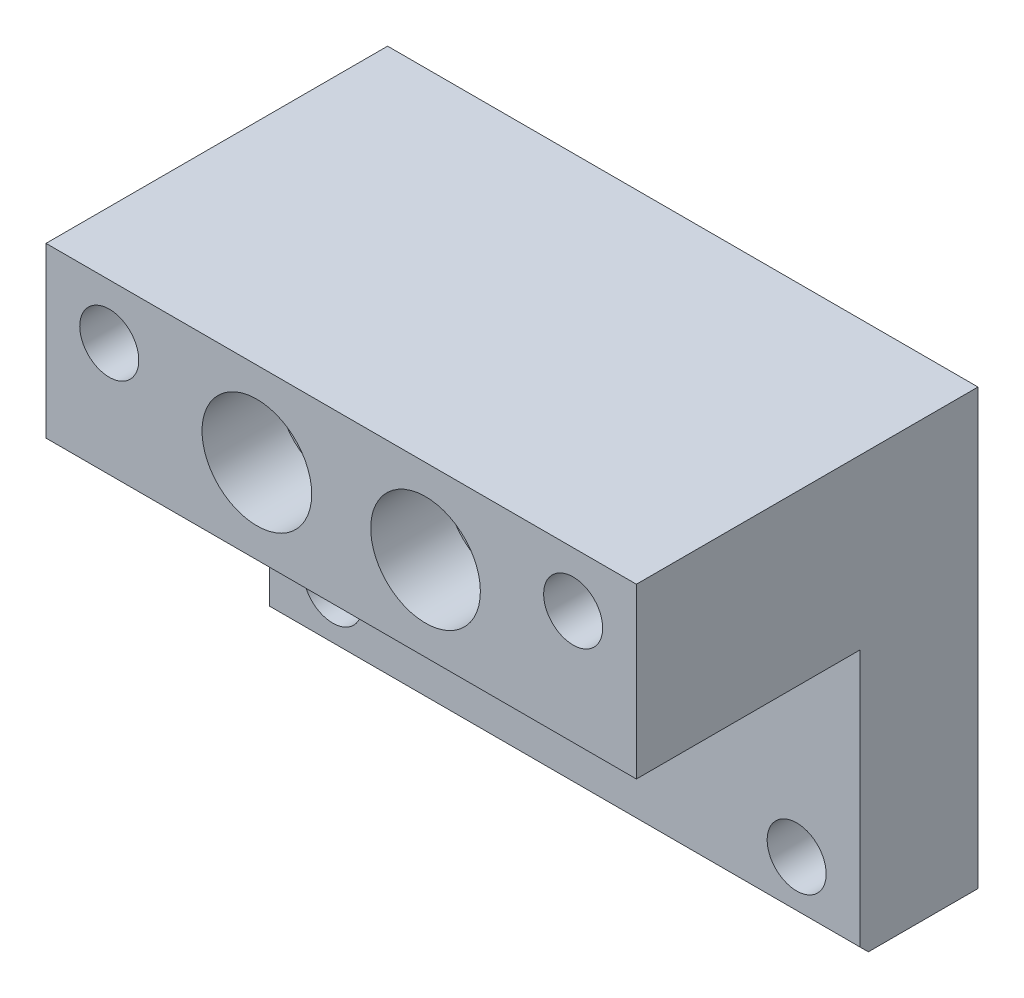
ISO-10303-21;
HEADER;
FILE_DESCRIPTION(('STEP AP214'),'2;1');
FILE_NAME('part.step','',(''),(''),'','','');
FILE_SCHEMA(('AUTOMOTIVE_DESIGN { 1 0 10303 214 1 1 1 1 }'));
ENDSEC;
DATA;
#1=APPLICATION_CONTEXT('core data for automotive mechanical design processes');
#2=APPLICATION_PROTOCOL_DEFINITION('international standard','automotive_design',2000,#1);
#3=PRODUCT_CONTEXT('',#1,'mechanical');
#4=PRODUCT('Part','Part','',(#3));
#5=PRODUCT_RELATED_PRODUCT_CATEGORY('part','',(#4));
#6=PRODUCT_DEFINITION_FORMATION('','',#4);
#7=PRODUCT_DEFINITION_CONTEXT('part definition',#1,'design');
#8=PRODUCT_DEFINITION('design','',#6,#7);
#9=PRODUCT_DEFINITION_SHAPE('','',#8);
#10=(LENGTH_UNIT() NAMED_UNIT(*) SI_UNIT(.MILLI.,.METRE.));
#11=(NAMED_UNIT(*) PLANE_ANGLE_UNIT() SI_UNIT($,.RADIAN.));
#12=(NAMED_UNIT(*) SI_UNIT($,.STERADIAN.) SOLID_ANGLE_UNIT());
#13=UNCERTAINTY_MEASURE_WITH_UNIT(LENGTH_MEASURE(1.E-05),#10,'distance_accuracy_value','');
#14=(GEOMETRIC_REPRESENTATION_CONTEXT(3) GLOBAL_UNCERTAINTY_ASSIGNED_CONTEXT((#13)) GLOBAL_UNIT_ASSIGNED_CONTEXT((#10,
#11,#12)) REPRESENTATION_CONTEXT('',''));
#15=CARTESIAN_POINT('',(0.,0.,0.));
#16=DIRECTION('',(0.,0.,1.));
#17=DIRECTION('',(1.,0.,0.));
#18=AXIS2_PLACEMENT_3D('',#15,#16,#17);
#19=CARTESIAN_POINT('',(0.,-18.5,40.5));
#20=DIRECTION('',(0.,0.,1.));
#21=DIRECTION('',(1.,0.,0.));
#22=AXIS2_PLACEMENT_3D('',#19,#20,#21);
#23=CYLINDRICAL_SURFACE('',#22,9.00000000000001);
#24=CARTESIAN_POINT('',(0.,-18.5,-40.5));
#25=DIRECTION('',(0.,0.,1.));
#26=DIRECTION('',(1.,0.,0.));
#27=AXIS2_PLACEMENT_3D('',#24,#25,#26);
#28=CIRCLE('',#27,9.00000000000001);
#29=CARTESIAN_POINT('',(9.00000000000002,-18.5,-40.5));
#30=VERTEX_POINT('',#29);
#31=EDGE_CURVE('E119',#30,#30,#28,.T.);
#32=ORIENTED_EDGE('',*,*,#31,.F.);
#33=EDGE_LOOP('',(#32));
#34=FACE_BOUND('',#33,.T.);
#35=CARTESIAN_POINT('',(0.,-18.5,-30.5));
#36=DIRECTION('',(0.,0.,1.));
#37=DIRECTION('',(1.,0.,0.));
#38=AXIS2_PLACEMENT_3D('',#35,#36,#37);
#39=CIRCLE('',#38,9.00000000000001);
#40=CARTESIAN_POINT('',(9.00000000000002,-18.5,-30.5));
#41=VERTEX_POINT('',#40);
#42=EDGE_CURVE('E161',#41,#41,#39,.F.);
#43=ORIENTED_EDGE('',*,*,#42,.F.);
#44=EDGE_LOOP('',(#43));
#45=FACE_BOUND('',#44,.T.);
#46=ADVANCED_FACE('F36',(#34,#45),#23,.F.);
#47=CARTESIAN_POINT('',(-70.,51.5,40.5));
#48=DIRECTION('',(1.,0.,0.));
#49=DIRECTION('',(0.,0.,-1.));
#50=AXIS2_PLACEMENT_3D('',#47,#48,#49);
#51=PLANE('',#50);
#52=DIRECTION('',(0.,0.,-1.));
#53=VECTOR('',#52,1.);
#54=CARTESIAN_POINT('',(-70.,-51.5,40.5));
#55=LINE('',#54,#53);
#56=CARTESIAN_POINT('',(-70.,-51.5,-14.5));
#57=VERTEX_POINT('',#56);
#58=CARTESIAN_POINT('',(-70.,-51.5,-40.5));
#59=VERTEX_POINT('',#58);
#60=EDGE_CURVE('E144',#57,#59,#55,.T.);
#61=ORIENTED_EDGE('',*,*,#60,.F.);
#62=DIRECTION('',(0.,-0.707106781186549,-0.707106781186546));
#63=VECTOR('',#62,1.);
#64=CARTESIAN_POINT('',(-70.,-51.5,-14.5));
#65=LINE('',#64,#63);
#66=CARTESIAN_POINT('',(-70.,-49.5,-12.5));
#67=VERTEX_POINT('',#66);
#68=EDGE_CURVE('E58',#57,#67,#65,.F.);
#69=ORIENTED_EDGE('',*,*,#68,.T.);
#70=DIRECTION('',(0.,-1.,0.));
#71=VECTOR('',#70,1.);
#72=CARTESIAN_POINT('',(-70.,11.5,-12.5));
#73=LINE('',#72,#71);
#74=CARTESIAN_POINT('',(-70.,11.5,-12.5));
#75=VERTEX_POINT('',#74);
#76=EDGE_CURVE('E117',#75,#67,#73,.T.);
#77=ORIENTED_EDGE('',*,*,#76,.F.);
#78=DIRECTION('',(0.,0.,-1.));
#79=VECTOR('',#78,1.);
#80=CARTESIAN_POINT('',(-70.,11.5,-12.5));
#81=LINE('',#80,#79);
#82=CARTESIAN_POINT('',(-70.,11.5,40.5));
#83=VERTEX_POINT('',#82);
#84=EDGE_CURVE('E100',#83,#75,#81,.T.);
#85=ORIENTED_EDGE('',*,*,#84,.F.);
#86=DIRECTION('',(0.,-1.,0.));
#87=VECTOR('',#86,1.);
#88=CARTESIAN_POINT('',(-70.,51.5,40.5));
#89=LINE('',#88,#87);
#90=CARTESIAN_POINT('',(-70.,51.5,40.5));
#91=VERTEX_POINT('',#90);
#92=EDGE_CURVE('E121',#91,#83,#89,.T.);
#93=ORIENTED_EDGE('',*,*,#92,.F.);
#94=DIRECTION('',(0.,0.,-1.));
#95=VECTOR('',#94,1.);
#96=CARTESIAN_POINT('',(-70.,51.5,40.5));
#97=LINE('',#96,#95);
#98=CARTESIAN_POINT('',(-70.,51.5,-40.5));
#99=VERTEX_POINT('',#98);
#100=EDGE_CURVE('E128',#91,#99,#97,.T.);
#101=ORIENTED_EDGE('',*,*,#100,.T.);
#102=DIRECTION('',(0.,-1.,0.));
#103=VECTOR('',#102,1.);
#104=CARTESIAN_POINT('',(-70.,51.5,-40.5));
#105=LINE('',#104,#103);
#106=EDGE_CURVE('E101',#99,#59,#105,.T.);
#107=ORIENTED_EDGE('',*,*,#106,.T.);
#108=EDGE_LOOP('',(#61,#69,#77,#85,#93,#101,#107));
#109=FACE_BOUND('',#108,.T.);
#110=ADVANCED_FACE('F174',(#109),#51,.F.);
#111=CARTESIAN_POINT('',(-70.,-51.5,40.5));
#112=DIRECTION('',(0.,1.,0.));
#113=DIRECTION('',(0.,0.,1.));
#114=AXIS2_PLACEMENT_3D('',#111,#112,#113);
#115=PLANE('',#114);
#116=DIRECTION('',(0.,0.,-1.));
#117=VECTOR('',#116,1.);
#118=CARTESIAN_POINT('',(70.,-51.5,40.5));
#119=LINE('',#118,#117);
#120=CARTESIAN_POINT('',(70.,-51.5,-14.5));
#121=VERTEX_POINT('',#120);
#122=CARTESIAN_POINT('',(70.,-51.5,-40.5));
#123=VERTEX_POINT('',#122);
#124=EDGE_CURVE('E142',#121,#123,#119,.T.);
#125=ORIENTED_EDGE('',*,*,#124,.F.);
#126=DIRECTION('',(-1.,0.,0.));
#127=VECTOR('',#126,1.);
#128=CARTESIAN_POINT('',(-70.,-51.5,-14.5));
#129=LINE('',#128,#127);
#130=EDGE_CURVE('E146',#121,#57,#129,.T.);
#131=ORIENTED_EDGE('',*,*,#130,.T.);
#132=ORIENTED_EDGE('',*,*,#60,.T.);
#133=DIRECTION('',(1.,0.,0.));
#134=VECTOR('',#133,1.);
#135=CARTESIAN_POINT('',(-70.,-51.5,-40.5));
#136=LINE('',#135,#134);
#137=EDGE_CURVE('E131',#59,#123,#136,.T.);
#138=ORIENTED_EDGE('',*,*,#137,.T.);
#139=EDGE_LOOP('',(#125,#131,#132,#138));
#140=FACE_BOUND('',#139,.T.);
#141=ADVANCED_FACE('F171',(#140),#115,.F.);
#142=CARTESIAN_POINT('',(70.,51.5,40.5));
#143=DIRECTION('',(-1.,0.,0.));
#144=DIRECTION('',(0.,0.,1.));
#145=AXIS2_PLACEMENT_3D('',#142,#143,#144);
#146=PLANE('',#145);
#147=DIRECTION('',(0.,-1.,0.));
#148=VECTOR('',#147,1.);
#149=CARTESIAN_POINT('',(70.,11.5,-12.5));
#150=LINE('',#149,#148);
#151=CARTESIAN_POINT('',(70.,11.5,-12.5));
#152=VERTEX_POINT('',#151);
#153=CARTESIAN_POINT('',(70.,-49.5,-12.5));
#154=VERTEX_POINT('',#153);
#155=EDGE_CURVE('E104',#152,#154,#150,.T.);
#156=ORIENTED_EDGE('',*,*,#155,.T.);
#157=DIRECTION('',(0.,0.707106781186549,0.707106781186546));
#158=VECTOR('',#157,1.);
#159=CARTESIAN_POINT('',(70.,-51.5,-14.5));
#160=LINE('',#159,#158);
#161=EDGE_CURVE('E11',#154,#121,#160,.F.);
#162=ORIENTED_EDGE('',*,*,#161,.T.);
#163=ORIENTED_EDGE('',*,*,#124,.T.);
#164=DIRECTION('',(0.,1.,0.));
#165=VECTOR('',#164,1.);
#166=CARTESIAN_POINT('',(70.,51.5,-40.5));
#167=LINE('',#166,#165);
#168=CARTESIAN_POINT('',(70.,51.5,-40.5));
#169=VERTEX_POINT('',#168);
#170=EDGE_CURVE('E134',#123,#169,#167,.T.);
#171=ORIENTED_EDGE('',*,*,#170,.T.);
#172=DIRECTION('',(0.,0.,-1.));
#173=VECTOR('',#172,1.);
#174=CARTESIAN_POINT('',(70.,51.5,40.5));
#175=LINE('',#174,#173);
#176=CARTESIAN_POINT('',(70.,51.5,40.5));
#177=VERTEX_POINT('',#176);
#178=EDGE_CURVE('E139',#177,#169,#175,.T.);
#179=ORIENTED_EDGE('',*,*,#178,.F.);
#180=DIRECTION('',(0.,1.,0.));
#181=VECTOR('',#180,1.);
#182=CARTESIAN_POINT('',(70.,51.5,40.5));
#183=LINE('',#182,#181);
#184=CARTESIAN_POINT('',(70.,11.5,40.5));
#185=VERTEX_POINT('',#184);
#186=EDGE_CURVE('E112',#185,#177,#183,.T.);
#187=ORIENTED_EDGE('',*,*,#186,.F.);
#188=DIRECTION('',(0.,0.,-1.));
#189=VECTOR('',#188,1.);
#190=CARTESIAN_POINT('',(70.,11.5,-12.5));
#191=LINE('',#190,#189);
#192=EDGE_CURVE('E97',#185,#152,#191,.T.);
#193=ORIENTED_EDGE('',*,*,#192,.T.);
#194=EDGE_LOOP('',(#156,#162,#163,#171,#179,#187,#193));
#195=FACE_BOUND('',#194,.T.);
#196=ADVANCED_FACE('F110',(#195),#146,.F.);
#197=CARTESIAN_POINT('',(-70.,51.5,40.5));
#198=DIRECTION('',(0.,-1.,0.));
#199=DIRECTION('',(0.,0.,-1.));
#200=AXIS2_PLACEMENT_3D('',#197,#198,#199);
#201=PLANE('',#200);
#202=DIRECTION('',(-1.,0.,0.));
#203=VECTOR('',#202,1.);
#204=CARTESIAN_POINT('',(-70.,51.5,-40.5));
#205=LINE('',#204,#203);
#206=EDGE_CURVE('E124',#169,#99,#205,.T.);
#207=ORIENTED_EDGE('',*,*,#206,.T.);
#208=ORIENTED_EDGE('',*,*,#100,.F.);
#209=DIRECTION('',(-1.,0.,0.));
#210=VECTOR('',#209,1.);
#211=CARTESIAN_POINT('',(-70.,51.5,40.5));
#212=LINE('',#211,#210);
#213=EDGE_CURVE('E126',#177,#91,#212,.T.);
#214=ORIENTED_EDGE('',*,*,#213,.F.);
#215=ORIENTED_EDGE('',*,*,#178,.T.);
#216=EDGE_LOOP('',(#207,#208,#214,#215));
#217=FACE_BOUND('',#216,.T.);
#218=ADVANCED_FACE('F184',(#217),#201,.F.);
#219=CARTESIAN_POINT('',(-70.,-51.5,40.5));
#220=DIRECTION('',(0.,0.,1.));
#221=DIRECTION('',(1.,0.,0.));
#222=AXIS2_PLACEMENT_3D('',#219,#220,#221);
#223=PLANE('',#222);
#224=CARTESIAN_POINT('',(55.,38.5,40.5));
#225=DIRECTION('',(0.,0.,-1.));
#226=DIRECTION('',(-1.,0.,0.));
#227=AXIS2_PLACEMENT_3D('',#224,#225,#226);
#228=CIRCLE('',#227,6.99999999999997);
#229=CARTESIAN_POINT('',(48.0000000000001,38.5,40.5));
#230=VERTEX_POINT('',#229);
#231=EDGE_CURVE('E159',#230,#230,#228,.T.);
#232=ORIENTED_EDGE('',*,*,#231,.T.);
#233=EDGE_LOOP('',(#232));
#234=FACE_BOUND('',#233,.T.);
#235=CARTESIAN_POINT('',(-55.,38.5,40.5));
#236=DIRECTION('',(0.,0.,-1.));
#237=DIRECTION('',(-1.,0.,0.));
#238=AXIS2_PLACEMENT_3D('',#235,#236,#237);
#239=CIRCLE('',#238,6.99999999999997);
#240=CARTESIAN_POINT('',(-61.9999999999999,38.5,40.5));
#241=VERTEX_POINT('',#240);
#242=EDGE_CURVE('E498',#241,#241,#239,.T.);
#243=ORIENTED_EDGE('',*,*,#242,.T.);
#244=EDGE_LOOP('',(#243));
#245=FACE_BOUND('',#244,.T.);
#246=CARTESIAN_POINT('',(-20.,31.5,40.5));
#247=DIRECTION('',(0.,0.,1.));
#248=DIRECTION('',(1.,0.,0.));
#249=AXIS2_PLACEMENT_3D('',#246,#247,#248);
#250=CIRCLE('',#249,13.);
#251=CARTESIAN_POINT('',(-6.99999999999999,31.5,40.5));
#252=VERTEX_POINT('',#251);
#253=EDGE_CURVE('E154',#252,#252,#250,.T.);
#254=ORIENTED_EDGE('',*,*,#253,.F.);
#255=EDGE_LOOP('',(#254));
#256=FACE_BOUND('',#255,.T.);
#257=CARTESIAN_POINT('',(20.,31.5,40.5));
#258=DIRECTION('',(0.,0.,1.));
#259=DIRECTION('',(1.,0.,0.));
#260=AXIS2_PLACEMENT_3D('',#257,#258,#259);
#261=CIRCLE('',#260,13.);
#262=CARTESIAN_POINT('',(33.,31.5,40.5));
#263=VERTEX_POINT('',#262);
#264=EDGE_CURVE('E529',#263,#263,#261,.T.);
#265=ORIENTED_EDGE('',*,*,#264,.F.);
#266=EDGE_LOOP('',(#265));
#267=FACE_BOUND('',#266,.T.);
#268=DIRECTION('',(-1.,0.,0.));
#269=VECTOR('',#268,1.);
#270=CARTESIAN_POINT('',(70.,11.5,40.5));
#271=LINE('',#270,#269);
#272=EDGE_CURVE('E102',#185,#83,#271,.T.);
#273=ORIENTED_EDGE('',*,*,#272,.F.);
#274=ORIENTED_EDGE('',*,*,#186,.T.);
#275=ORIENTED_EDGE('',*,*,#213,.T.);
#276=ORIENTED_EDGE('',*,*,#92,.T.);
#277=EDGE_LOOP('',(#273,#274,#275,#276));
#278=FACE_BOUND('',#277,.T.);
#279=ADVANCED_FACE('F186',(#234,#245,#256,#267,#278),#223,.T.);
#280=CARTESIAN_POINT('',(-70.,-51.5,-40.5));
#281=DIRECTION('',(0.,0.,1.));
#282=DIRECTION('',(1.,0.,0.));
#283=AXIS2_PLACEMENT_3D('',#280,#281,#282);
#284=PLANE('',#283);
#285=CARTESIAN_POINT('',(55.,-38.5,-40.5));
#286=DIRECTION('',(0.,0.,-1.));
#287=DIRECTION('',(-1.,0.,0.));
#288=AXIS2_PLACEMENT_3D('',#285,#286,#287);
#289=CIRCLE('',#288,9.99999999999999);
#290=CARTESIAN_POINT('',(45.,-38.5,-40.5));
#291=VERTEX_POINT('',#290);
#292=EDGE_CURVE('E160',#291,#291,#289,.T.);
#293=ORIENTED_EDGE('',*,*,#292,.F.);
#294=EDGE_LOOP('',(#293));
#295=FACE_BOUND('',#294,.T.);
#296=CARTESIAN_POINT('',(55.,38.5,-40.5));
#297=DIRECTION('',(0.,0.,-1.));
#298=DIRECTION('',(-1.,0.,0.));
#299=AXIS2_PLACEMENT_3D('',#296,#297,#298);
#300=CIRCLE('',#299,9.99999999999999);
#301=CARTESIAN_POINT('',(45.,38.5,-40.5));
#302=VERTEX_POINT('',#301);
#303=EDGE_CURVE('E495',#302,#302,#300,.T.);
#304=ORIENTED_EDGE('',*,*,#303,.F.);
#305=EDGE_LOOP('',(#304));
#306=FACE_BOUND('',#305,.T.);
#307=CARTESIAN_POINT('',(-55.,38.5,-40.5));
#308=DIRECTION('',(0.,0.,-1.));
#309=DIRECTION('',(-1.,0.,0.));
#310=AXIS2_PLACEMENT_3D('',#307,#308,#309);
#311=CIRCLE('',#310,9.99999999999999);
#312=CARTESIAN_POINT('',(-65.,38.5,-40.5));
#313=VERTEX_POINT('',#312);
#314=EDGE_CURVE('E507',#313,#313,#311,.T.);
#315=ORIENTED_EDGE('',*,*,#314,.F.);
#316=EDGE_LOOP('',(#315));
#317=FACE_BOUND('',#316,.T.);
#318=CARTESIAN_POINT('',(-55.,-38.5,-40.5));
#319=DIRECTION('',(0.,0.,-1.));
#320=DIRECTION('',(-1.,0.,0.));
#321=AXIS2_PLACEMENT_3D('',#318,#319,#320);
#322=CIRCLE('',#321,9.99999999999999);
#323=CARTESIAN_POINT('',(-65.,-38.5,-40.5));
#324=VERTEX_POINT('',#323);
#325=EDGE_CURVE('E155',#324,#324,#322,.T.);
#326=ORIENTED_EDGE('',*,*,#325,.F.);
#327=EDGE_LOOP('',(#326));
#328=FACE_BOUND('',#327,.T.);
#329=CARTESIAN_POINT('',(-20.,31.5,-40.5));
#330=DIRECTION('',(0.,0.,1.));
#331=DIRECTION('',(1.,0.,0.));
#332=AXIS2_PLACEMENT_3D('',#329,#330,#331);
#333=CIRCLE('',#332,9.00000000000001);
#334=CARTESIAN_POINT('',(-11.,31.5,-40.5));
#335=VERTEX_POINT('',#334);
#336=EDGE_CURVE('E520',#335,#335,#333,.T.);
#337=ORIENTED_EDGE('',*,*,#336,.T.);
#338=EDGE_LOOP('',(#337));
#339=FACE_BOUND('',#338,.T.);
#340=CARTESIAN_POINT('',(20.,31.5,-40.5));
#341=DIRECTION('',(0.,0.,1.));
#342=DIRECTION('',(1.,0.,0.));
#343=AXIS2_PLACEMENT_3D('',#340,#341,#342);
#344=CIRCLE('',#343,9.00000000000001);
#345=CARTESIAN_POINT('',(29.,31.5,-40.5));
#346=VERTEX_POINT('',#345);
#347=EDGE_CURVE('E147',#346,#346,#344,.T.);
#348=ORIENTED_EDGE('',*,*,#347,.T.);
#349=EDGE_LOOP('',(#348));
#350=FACE_BOUND('',#349,.T.);
#351=ORIENTED_EDGE('',*,*,#31,.T.);
#352=EDGE_LOOP('',(#351));
#353=FACE_BOUND('',#352,.T.);
#354=ORIENTED_EDGE('',*,*,#106,.F.);
#355=ORIENTED_EDGE('',*,*,#206,.F.);
#356=ORIENTED_EDGE('',*,*,#170,.F.);
#357=ORIENTED_EDGE('',*,*,#137,.F.);
#358=EDGE_LOOP('',(#354,#355,#356,#357));
#359=FACE_BOUND('',#358,.T.);
#360=ADVANCED_FACE('F180',(#295,#306,#317,#328,#339,#350,#353,#359),#284,.F.);
#361=CARTESIAN_POINT('',(70.,11.5,-12.5));
#362=DIRECTION('',(0.,0.,-1.));
#363=DIRECTION('',(0.,1.,0.));
#364=AXIS2_PLACEMENT_3D('',#361,#362,#363);
#365=PLANE('',#364);
#366=CARTESIAN_POINT('',(0.,-18.5,-12.5));
#367=DIRECTION('',(0.,0.,1.));
#368=DIRECTION('',(1.,0.,0.));
#369=AXIS2_PLACEMENT_3D('',#366,#367,#368);
#370=CIRCLE('',#369,13.);
#371=CARTESIAN_POINT('',(13.,-18.5,-12.5));
#372=VERTEX_POINT('',#371);
#373=EDGE_CURVE('E475',#372,#372,#370,.T.);
#374=ORIENTED_EDGE('',*,*,#373,.F.);
#375=EDGE_LOOP('',(#374));
#376=FACE_BOUND('',#375,.T.);
#377=CARTESIAN_POINT('',(55.,-38.5,-12.5));
#378=DIRECTION('',(0.,0.,-1.));
#379=DIRECTION('',(0.,1.,0.));
#380=AXIS2_PLACEMENT_3D('',#377,#378,#379);
#381=CIRCLE('',#380,6.99999999999999);
#382=CARTESIAN_POINT('',(55.,-31.5,-12.5));
#383=VERTEX_POINT('',#382);
#384=EDGE_CURVE('E156',#383,#383,#381,.T.);
#385=ORIENTED_EDGE('',*,*,#384,.T.);
#386=EDGE_LOOP('',(#385));
#387=FACE_BOUND('',#386,.T.);
#388=CARTESIAN_POINT('',(-55.,-38.5,-12.5));
#389=DIRECTION('',(0.,0.,-1.));
#390=DIRECTION('',(0.,1.,0.));
#391=AXIS2_PLACEMENT_3D('',#388,#389,#390);
#392=CIRCLE('',#391,6.99999999999999);
#393=CARTESIAN_POINT('',(-55.,-31.5,-12.5));
#394=VERTEX_POINT('',#393);
#395=EDGE_CURVE('E151',#394,#394,#392,.T.);
#396=ORIENTED_EDGE('',*,*,#395,.T.);
#397=EDGE_LOOP('',(#396));
#398=FACE_BOUND('',#397,.T.);
#399=ORIENTED_EDGE('',*,*,#76,.T.);
#400=DIRECTION('',(1.,0.,0.));
#401=VECTOR('',#400,1.);
#402=CARTESIAN_POINT('',(70.,-49.5,-12.5));
#403=LINE('',#402,#401);
#404=EDGE_CURVE('E44',#67,#154,#403,.T.);
#405=ORIENTED_EDGE('',*,*,#404,.T.);
#406=ORIENTED_EDGE('',*,*,#155,.F.);
#407=DIRECTION('',(-1.,0.,0.));
#408=VECTOR('',#407,1.);
#409=CARTESIAN_POINT('',(70.,11.5,-12.5));
#410=LINE('',#409,#408);
#411=EDGE_CURVE('E94',#152,#75,#410,.T.);
#412=ORIENTED_EDGE('',*,*,#411,.T.);
#413=EDGE_LOOP('',(#399,#405,#406,#412));
#414=FACE_BOUND('',#413,.T.);
#415=ADVANCED_FACE('F105',(#376,#387,#398,#414),#365,.F.);
#416=CARTESIAN_POINT('',(70.,11.5,-12.5));
#417=DIRECTION('',(0.,1.,0.));
#418=DIRECTION('',(0.,0.,1.));
#419=AXIS2_PLACEMENT_3D('',#416,#417,#418);
#420=PLANE('',#419);
#421=ORIENTED_EDGE('',*,*,#84,.T.);
#422=ORIENTED_EDGE('',*,*,#411,.F.);
#423=ORIENTED_EDGE('',*,*,#192,.F.);
#424=ORIENTED_EDGE('',*,*,#272,.T.);
#425=EDGE_LOOP('',(#421,#422,#423,#424));
#426=FACE_BOUND('',#425,.T.);
#427=ADVANCED_FACE('F95',(#426),#420,.F.);
#428=CARTESIAN_POINT('',(20.,31.5,40.5));
#429=DIRECTION('',(0.,0.,1.));
#430=DIRECTION('',(1.,0.,0.));
#431=AXIS2_PLACEMENT_3D('',#428,#429,#430);
#432=CYLINDRICAL_SURFACE('',#431,9.00000000000001);
#433=CARTESIAN_POINT('',(20.,31.5,22.5));
#434=DIRECTION('',(0.,0.,1.));
#435=DIRECTION('',(1.,0.,0.));
#436=AXIS2_PLACEMENT_3D('',#433,#434,#435);
#437=CIRCLE('',#436,9.00000000000001);
#438=CARTESIAN_POINT('',(29.,31.5,22.5));
#439=VERTEX_POINT('',#438);
#440=EDGE_CURVE('E150',#439,#439,#437,.T.);
#441=ORIENTED_EDGE('',*,*,#440,.T.);
#442=EDGE_LOOP('',(#441));
#443=FACE_BOUND('',#442,.T.);
#444=ORIENTED_EDGE('',*,*,#347,.F.);
#445=EDGE_LOOP('',(#444));
#446=FACE_BOUND('',#445,.T.);
#447=ADVANCED_FACE('F205',(#443,#446),#432,.F.);
#448=CARTESIAN_POINT('',(29.,31.5,22.5));
#449=DIRECTION('',(0.,0.,-1.));
#450=DIRECTION('',(-1.,0.,0.));
#451=AXIS2_PLACEMENT_3D('',#448,#449,#450);
#452=PLANE('',#451);
#453=ORIENTED_EDGE('',*,*,#440,.F.);
#454=EDGE_LOOP('',(#453));
#455=FACE_BOUND('',#454,.T.);
#456=CARTESIAN_POINT('',(20.,31.5,22.5));
#457=DIRECTION('',(0.,0.,1.));
#458=DIRECTION('',(1.,0.,0.));
#459=AXIS2_PLACEMENT_3D('',#456,#457,#458);
#460=CIRCLE('',#459,13.);
#461=CARTESIAN_POINT('',(33.,31.5,22.5));
#462=VERTEX_POINT('',#461);
#463=EDGE_CURVE('E532',#462,#462,#460,.T.);
#464=ORIENTED_EDGE('',*,*,#463,.T.);
#465=EDGE_LOOP('',(#464));
#466=FACE_BOUND('',#465,.T.);
#467=ADVANCED_FACE('F259',(#455,#466),#452,.F.);
#468=CARTESIAN_POINT('',(20.,31.5,40.5));
#469=DIRECTION('',(0.,0.,1.));
#470=DIRECTION('',(1.,0.,0.));
#471=AXIS2_PLACEMENT_3D('',#468,#469,#470);
#472=CYLINDRICAL_SURFACE('',#471,13.);
#473=ORIENTED_EDGE('',*,*,#463,.F.);
#474=EDGE_LOOP('',(#473));
#475=FACE_BOUND('',#474,.T.);
#476=ORIENTED_EDGE('',*,*,#264,.T.);
#477=EDGE_LOOP('',(#476));
#478=FACE_BOUND('',#477,.T.);
#479=ADVANCED_FACE('F266',(#475,#478),#472,.F.);
#480=CARTESIAN_POINT('',(-20.,31.5,40.5));
#481=DIRECTION('',(0.,0.,1.));
#482=DIRECTION('',(1.,0.,0.));
#483=AXIS2_PLACEMENT_3D('',#480,#481,#482);
#484=CYLINDRICAL_SURFACE('',#483,9.00000000000001);
#485=CARTESIAN_POINT('',(-20.,31.5,22.5));
#486=DIRECTION('',(0.,0.,1.));
#487=DIRECTION('',(1.,0.,0.));
#488=AXIS2_PLACEMENT_3D('',#485,#486,#487);
#489=CIRCLE('',#488,9.00000000000001);
#490=CARTESIAN_POINT('',(-11.,31.5,22.5));
#491=VERTEX_POINT('',#490);
#492=EDGE_CURVE('E526',#491,#491,#489,.T.);
#493=ORIENTED_EDGE('',*,*,#492,.T.);
#494=EDGE_LOOP('',(#493));
#495=FACE_BOUND('',#494,.T.);
#496=ORIENTED_EDGE('',*,*,#336,.F.);
#497=EDGE_LOOP('',(#496));
#498=FACE_BOUND('',#497,.T.);
#499=ADVANCED_FACE('F273',(#495,#498),#484,.F.);
#500=CARTESIAN_POINT('',(-11.,31.5,22.5));
#501=DIRECTION('',(0.,0.,-1.));
#502=DIRECTION('',(-1.,0.,0.));
#503=AXIS2_PLACEMENT_3D('',#500,#501,#502);
#504=PLANE('',#503);
#505=ORIENTED_EDGE('',*,*,#492,.F.);
#506=EDGE_LOOP('',(#505));
#507=FACE_BOUND('',#506,.T.);
#508=CARTESIAN_POINT('',(-20.,31.5,22.5));
#509=DIRECTION('',(0.,0.,1.));
#510=DIRECTION('',(1.,0.,0.));
#511=AXIS2_PLACEMENT_3D('',#508,#509,#510);
#512=CIRCLE('',#511,13.);
#513=CARTESIAN_POINT('',(-7.,31.5,22.5));
#514=VERTEX_POINT('',#513);
#515=EDGE_CURVE('E523',#514,#514,#512,.T.);
#516=ORIENTED_EDGE('',*,*,#515,.T.);
#517=EDGE_LOOP('',(#516));
#518=FACE_BOUND('',#517,.T.);
#519=ADVANCED_FACE('F281',(#507,#518),#504,.F.);
#520=CARTESIAN_POINT('',(-20.,31.5,40.5));
#521=DIRECTION('',(0.,0.,1.));
#522=DIRECTION('',(1.,0.,0.));
#523=AXIS2_PLACEMENT_3D('',#520,#521,#522);
#524=CYLINDRICAL_SURFACE('',#523,13.);
#525=ORIENTED_EDGE('',*,*,#515,.F.);
#526=EDGE_LOOP('',(#525));
#527=FACE_BOUND('',#526,.T.);
#528=ORIENTED_EDGE('',*,*,#253,.T.);
#529=EDGE_LOOP('',(#528));
#530=FACE_BOUND('',#529,.T.);
#531=ADVANCED_FACE('F289',(#527,#530),#524,.F.);
#532=CARTESIAN_POINT('',(-55.,-38.5,-40.5));
#533=DIRECTION('',(0.,0.,-1.));
#534=DIRECTION('',(-1.,0.,0.));
#535=AXIS2_PLACEMENT_3D('',#532,#533,#534);
#536=CYLINDRICAL_SURFACE('',#535,6.99999999999999);
#537=CARTESIAN_POINT('',(-55.,-38.5,-27.5));
#538=DIRECTION('',(0.,0.,-1.));
#539=DIRECTION('',(-1.,0.,0.));
#540=AXIS2_PLACEMENT_3D('',#537,#538,#539);
#541=CIRCLE('',#540,7.);
#542=CARTESIAN_POINT('',(-62.,-38.5,-27.5));
#543=VERTEX_POINT('',#542);
#544=EDGE_CURVE('E510',#543,#543,#541,.T.);
#545=ORIENTED_EDGE('',*,*,#544,.T.);
#546=EDGE_LOOP('',(#545));
#547=FACE_BOUND('',#546,.T.);
#548=ORIENTED_EDGE('',*,*,#395,.F.);
#549=EDGE_LOOP('',(#548));
#550=FACE_BOUND('',#549,.T.);
#551=ADVANCED_FACE('F296',(#547,#550),#536,.F.);
#552=CARTESIAN_POINT('',(-55.,-38.5,-40.5));
#553=DIRECTION('',(0.,0.,-1.));
#554=DIRECTION('',(-1.,0.,0.));
#555=AXIS2_PLACEMENT_3D('',#552,#553,#554);
#556=CYLINDRICAL_SURFACE('',#555,9.99999999999999);
#557=CARTESIAN_POINT('',(-55.,-38.5,-27.5));
#558=DIRECTION('',(0.,0.,-1.));
#559=DIRECTION('',(-1.,0.,0.));
#560=AXIS2_PLACEMENT_3D('',#557,#558,#559);
#561=CIRCLE('',#560,9.99999999999999);
#562=CARTESIAN_POINT('',(-65.,-38.5,-27.5));
#563=VERTEX_POINT('',#562);
#564=EDGE_CURVE('E513',#563,#563,#561,.T.);
#565=ORIENTED_EDGE('',*,*,#564,.F.);
#566=EDGE_LOOP('',(#565));
#567=FACE_BOUND('',#566,.T.);
#568=ORIENTED_EDGE('',*,*,#325,.T.);
#569=EDGE_LOOP('',(#568));
#570=FACE_BOUND('',#569,.T.);
#571=ADVANCED_FACE('F303',(#567,#570),#556,.F.);
#572=CARTESIAN_POINT('',(-48.,-38.5,-27.5));
#573=DIRECTION('',(0.,0.,1.));
#574=DIRECTION('',(1.,0.,0.));
#575=AXIS2_PLACEMENT_3D('',#572,#573,#574);
#576=PLANE('',#575);
#577=ORIENTED_EDGE('',*,*,#544,.F.);
#578=EDGE_LOOP('',(#577));
#579=FACE_BOUND('',#578,.T.);
#580=ORIENTED_EDGE('',*,*,#564,.T.);
#581=EDGE_LOOP('',(#580));
#582=FACE_BOUND('',#581,.T.);
#583=ADVANCED_FACE('F311',(#579,#582),#576,.F.);
#584=CARTESIAN_POINT('',(-55.,38.5,-40.5));
#585=DIRECTION('',(0.,0.,-1.));
#586=DIRECTION('',(-1.,0.,0.));
#587=AXIS2_PLACEMENT_3D('',#584,#585,#586);
#588=CYLINDRICAL_SURFACE('',#587,9.99999999999999);
#589=CARTESIAN_POINT('',(-55.,38.5,-27.5));
#590=DIRECTION('',(0.,0.,-1.));
#591=DIRECTION('',(-1.,0.,0.));
#592=AXIS2_PLACEMENT_3D('',#589,#590,#591);
#593=CIRCLE('',#592,9.99999999999999);
#594=CARTESIAN_POINT('',(-65.,38.5,-27.5));
#595=VERTEX_POINT('',#594);
#596=EDGE_CURVE('E504',#595,#595,#593,.T.);
#597=ORIENTED_EDGE('',*,*,#596,.F.);
#598=EDGE_LOOP('',(#597));
#599=FACE_BOUND('',#598,.T.);
#600=ORIENTED_EDGE('',*,*,#314,.T.);
#601=EDGE_LOOP('',(#600));
#602=FACE_BOUND('',#601,.T.);
#603=ADVANCED_FACE('F319',(#599,#602),#588,.F.);
#604=CARTESIAN_POINT('',(-48.,38.5,-27.5));
#605=DIRECTION('',(0.,0.,1.));
#606=DIRECTION('',(1.,0.,0.));
#607=AXIS2_PLACEMENT_3D('',#604,#605,#606);
#608=PLANE('',#607);
#609=CARTESIAN_POINT('',(-55.,38.5,-27.5));
#610=DIRECTION('',(0.,0.,-1.));
#611=DIRECTION('',(-1.,0.,0.));
#612=AXIS2_PLACEMENT_3D('',#609,#610,#611);
#613=CIRCLE('',#612,7.);
#614=CARTESIAN_POINT('',(-62.,38.5,-27.5));
#615=VERTEX_POINT('',#614);
#616=EDGE_CURVE('E501',#615,#615,#613,.T.);
#617=ORIENTED_EDGE('',*,*,#616,.F.);
#618=EDGE_LOOP('',(#617));
#619=FACE_BOUND('',#618,.T.);
#620=ORIENTED_EDGE('',*,*,#596,.T.);
#621=EDGE_LOOP('',(#620));
#622=FACE_BOUND('',#621,.T.);
#623=ADVANCED_FACE('F327',(#619,#622),#608,.F.);
#624=CARTESIAN_POINT('',(-55.,38.5,-40.5));
#625=DIRECTION('',(0.,0.,-1.));
#626=DIRECTION('',(-1.,0.,0.));
#627=AXIS2_PLACEMENT_3D('',#624,#625,#626);
#628=CYLINDRICAL_SURFACE('',#627,6.99999999999999);
#629=ORIENTED_EDGE('',*,*,#242,.F.);
#630=EDGE_LOOP('',(#629));
#631=FACE_BOUND('',#630,.T.);
#632=ORIENTED_EDGE('',*,*,#616,.T.);
#633=EDGE_LOOP('',(#632));
#634=FACE_BOUND('',#633,.T.);
#635=ADVANCED_FACE('F335',(#631,#634),#628,.F.);
#636=CARTESIAN_POINT('',(55.,38.5,-40.5));
#637=DIRECTION('',(0.,0.,-1.));
#638=DIRECTION('',(-1.,0.,0.));
#639=AXIS2_PLACEMENT_3D('',#636,#637,#638);
#640=CYLINDRICAL_SURFACE('',#639,9.99999999999999);
#641=CARTESIAN_POINT('',(55.,38.5,-27.5));
#642=DIRECTION('',(0.,0.,-1.));
#643=DIRECTION('',(-1.,0.,0.));
#644=AXIS2_PLACEMENT_3D('',#641,#642,#643);
#645=CIRCLE('',#644,9.99999999999999);
#646=CARTESIAN_POINT('',(45.,38.5,-27.5));
#647=VERTEX_POINT('',#646);
#648=EDGE_CURVE('E492',#647,#647,#645,.T.);
#649=ORIENTED_EDGE('',*,*,#648,.F.);
#650=EDGE_LOOP('',(#649));
#651=FACE_BOUND('',#650,.T.);
#652=ORIENTED_EDGE('',*,*,#303,.T.);
#653=EDGE_LOOP('',(#652));
#654=FACE_BOUND('',#653,.T.);
#655=ADVANCED_FACE('F343',(#651,#654),#640,.F.);
#656=CARTESIAN_POINT('',(62.,38.5,-27.5));
#657=DIRECTION('',(0.,0.,1.));
#658=DIRECTION('',(1.,0.,0.));
#659=AXIS2_PLACEMENT_3D('',#656,#657,#658);
#660=PLANE('',#659);
#661=CARTESIAN_POINT('',(55.,38.5,-27.5));
#662=DIRECTION('',(0.,0.,-1.));
#663=DIRECTION('',(-1.,0.,0.));
#664=AXIS2_PLACEMENT_3D('',#661,#662,#663);
#665=CIRCLE('',#664,7.);
#666=CARTESIAN_POINT('',(48.,38.5,-27.5));
#667=VERTEX_POINT('',#666);
#668=EDGE_CURVE('E489',#667,#667,#665,.T.);
#669=ORIENTED_EDGE('',*,*,#668,.F.);
#670=EDGE_LOOP('',(#669));
#671=FACE_BOUND('',#670,.T.);
#672=ORIENTED_EDGE('',*,*,#648,.T.);
#673=EDGE_LOOP('',(#672));
#674=FACE_BOUND('',#673,.T.);
#675=ADVANCED_FACE('F351',(#671,#674),#660,.F.);
#676=CARTESIAN_POINT('',(55.,38.5,-40.5));
#677=DIRECTION('',(0.,0.,-1.));
#678=DIRECTION('',(-1.,0.,0.));
#679=AXIS2_PLACEMENT_3D('',#676,#677,#678);
#680=CYLINDRICAL_SURFACE('',#679,6.99999999999999);
#681=ORIENTED_EDGE('',*,*,#231,.F.);
#682=EDGE_LOOP('',(#681));
#683=FACE_BOUND('',#682,.T.);
#684=ORIENTED_EDGE('',*,*,#668,.T.);
#685=EDGE_LOOP('',(#684));
#686=FACE_BOUND('',#685,.T.);
#687=ADVANCED_FACE('F359',(#683,#686),#680,.F.);
#688=CARTESIAN_POINT('',(55.,-38.5,-40.5));
#689=DIRECTION('',(0.,0.,-1.));
#690=DIRECTION('',(-1.,0.,0.));
#691=AXIS2_PLACEMENT_3D('',#688,#689,#690);
#692=CYLINDRICAL_SURFACE('',#691,6.99999999999999);
#693=CARTESIAN_POINT('',(55.,-38.5,-27.5));
#694=DIRECTION('',(0.,0.,-1.));
#695=DIRECTION('',(-1.,0.,0.));
#696=AXIS2_PLACEMENT_3D('',#693,#694,#695);
#697=CIRCLE('',#696,7.);
#698=CARTESIAN_POINT('',(48.,-38.5,-27.5));
#699=VERTEX_POINT('',#698);
#700=EDGE_CURVE('E164',#699,#699,#697,.T.);
#701=ORIENTED_EDGE('',*,*,#700,.T.);
#702=EDGE_LOOP('',(#701));
#703=FACE_BOUND('',#702,.T.);
#704=ORIENTED_EDGE('',*,*,#384,.F.);
#705=EDGE_LOOP('',(#704));
#706=FACE_BOUND('',#705,.T.);
#707=ADVANCED_FACE('F367',(#703,#706),#692,.F.);
#708=CARTESIAN_POINT('',(55.,-38.5,-40.5));
#709=DIRECTION('',(0.,0.,-1.));
#710=DIRECTION('',(-1.,0.,0.));
#711=AXIS2_PLACEMENT_3D('',#708,#709,#710);
#712=CYLINDRICAL_SURFACE('',#711,9.99999999999999);
#713=CARTESIAN_POINT('',(55.,-38.5,-27.5));
#714=DIRECTION('',(0.,0.,-1.));
#715=DIRECTION('',(-1.,0.,0.));
#716=AXIS2_PLACEMENT_3D('',#713,#714,#715);
#717=CIRCLE('',#716,9.99999999999999);
#718=CARTESIAN_POINT('',(45.,-38.5,-27.5));
#719=VERTEX_POINT('',#718);
#720=EDGE_CURVE('E482',#719,#719,#717,.T.);
#721=ORIENTED_EDGE('',*,*,#720,.F.);
#722=EDGE_LOOP('',(#721));
#723=FACE_BOUND('',#722,.T.);
#724=ORIENTED_EDGE('',*,*,#292,.T.);
#725=EDGE_LOOP('',(#724));
#726=FACE_BOUND('',#725,.T.);
#727=ADVANCED_FACE('F375',(#723,#726),#712,.F.);
#728=CARTESIAN_POINT('',(62.,-38.5,-27.5));
#729=DIRECTION('',(0.,0.,1.));
#730=DIRECTION('',(1.,0.,0.));
#731=AXIS2_PLACEMENT_3D('',#728,#729,#730);
#732=PLANE('',#731);
#733=ORIENTED_EDGE('',*,*,#700,.F.);
#734=EDGE_LOOP('',(#733));
#735=FACE_BOUND('',#734,.T.);
#736=ORIENTED_EDGE('',*,*,#720,.T.);
#737=EDGE_LOOP('',(#736));
#738=FACE_BOUND('',#737,.T.);
#739=ADVANCED_FACE('F383',(#735,#738),#732,.F.);
#740=CARTESIAN_POINT('',(0.,-18.5,-30.5));
#741=DIRECTION('',(0.,0.,1.));
#742=DIRECTION('',(1.,0.,0.));
#743=AXIS2_PLACEMENT_3D('',#740,#741,#742);
#744=PLANE('',#743);
#745=CARTESIAN_POINT('',(0.,-18.5,-30.5));
#746=DIRECTION('',(0.,0.,1.));
#747=DIRECTION('',(1.,0.,0.));
#748=AXIS2_PLACEMENT_3D('',#745,#746,#747);
#749=CIRCLE('',#748,13.);
#750=CARTESIAN_POINT('',(13.,-18.5,-30.5));
#751=VERTEX_POINT('',#750);
#752=EDGE_CURVE('E165',#751,#751,#749,.T.);
#753=ORIENTED_EDGE('',*,*,#752,.T.);
#754=EDGE_LOOP('',(#753));
#755=FACE_BOUND('',#754,.T.);
#756=ORIENTED_EDGE('',*,*,#42,.T.);
#757=EDGE_LOOP('',(#756));
#758=FACE_BOUND('',#757,.T.);
#759=ADVANCED_FACE('F192',(#755,#758),#744,.T.);
#760=CARTESIAN_POINT('',(0.,-18.5,-30.5));
#761=DIRECTION('',(0.,0.,1.));
#762=DIRECTION('',(1.,0.,0.));
#763=AXIS2_PLACEMENT_3D('',#760,#761,#762);
#764=CYLINDRICAL_SURFACE('',#763,13.);
#765=ORIENTED_EDGE('',*,*,#752,.F.);
#766=EDGE_LOOP('',(#765));
#767=FACE_BOUND('',#766,.T.);
#768=ORIENTED_EDGE('',*,*,#373,.T.);
#769=EDGE_LOOP('',(#768));
#770=FACE_BOUND('',#769,.T.);
#771=ADVANCED_FACE('F188',(#767,#770),#764,.F.);
#772=CARTESIAN_POINT('',(-70.,-51.5,-14.5));
#773=DIRECTION('',(0.,0.707106781186546,-0.707106781186549));
#774=DIRECTION('',(0.,0.707106781186549,0.707106781186546));
#775=AXIS2_PLACEMENT_3D('',#772,#773,#774);
#776=PLANE('',#775);
#777=ORIENTED_EDGE('',*,*,#161,.F.);
#778=ORIENTED_EDGE('',*,*,#404,.F.);
#779=ORIENTED_EDGE('',*,*,#68,.F.);
#780=ORIENTED_EDGE('',*,*,#130,.F.);
#781=EDGE_LOOP('',(#777,#778,#779,#780));
#782=FACE_BOUND('',#781,.T.);
#783=ADVANCED_FACE('F38',(#782),#776,.F.);
#784=CLOSED_SHELL('',(#46,#110,#141,#196,#218,#279,#360,#415,#427,#447,#467,#479,#499,#519,#531,
#551,#571,#583,#603,#623,#635,#655,#675,#687,#707,#727,#739,#759,#771,#783));
#785=MANIFOLD_SOLID_BREP('B2',#784);
#786=ADVANCED_BREP_SHAPE_REPRESENTATION('',(#18,#785),#14);
#787=SHAPE_DEFINITION_REPRESENTATION(#9,#786);
ENDSEC;
END-ISO-10303-21;
